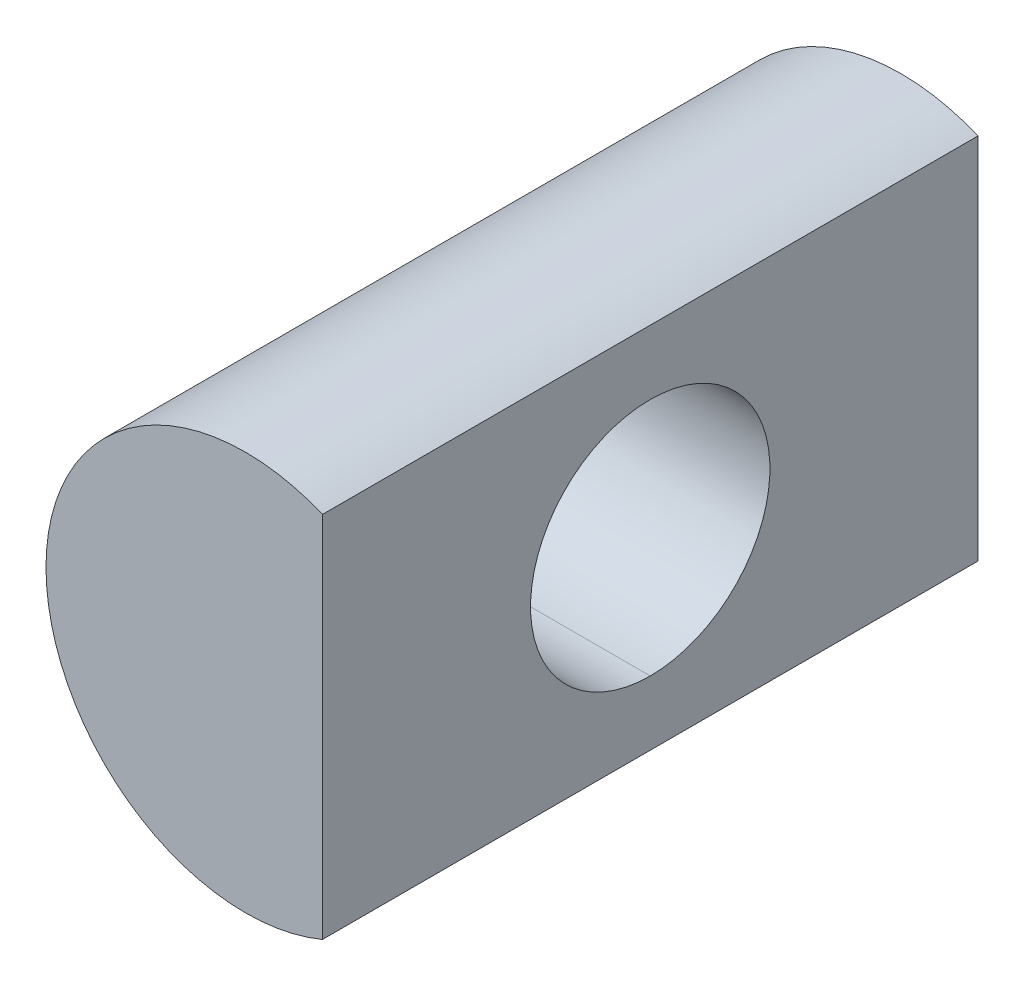
ISO-10303-21;
HEADER;
FILE_DESCRIPTION(('STEP AP214'),'2;1');
FILE_NAME('part.step','',(''),(''),'','','');
FILE_SCHEMA(('AUTOMOTIVE_DESIGN { 1 0 10303 214 1 1 1 1 }'));
ENDSEC;
DATA;
#1=APPLICATION_CONTEXT('core data for automotive mechanical design processes');
#2=APPLICATION_PROTOCOL_DEFINITION('international standard','automotive_design',2000,#1);
#3=PRODUCT_CONTEXT('',#1,'mechanical');
#4=PRODUCT('Part','Part','',(#3));
#5=PRODUCT_RELATED_PRODUCT_CATEGORY('part','',(#4));
#6=PRODUCT_DEFINITION_FORMATION('','',#4);
#7=PRODUCT_DEFINITION_CONTEXT('part definition',#1,'design');
#8=PRODUCT_DEFINITION('design','',#6,#7);
#9=PRODUCT_DEFINITION_SHAPE('','',#8);
#10=(LENGTH_UNIT() NAMED_UNIT(*) SI_UNIT(.MILLI.,.METRE.));
#11=(NAMED_UNIT(*) PLANE_ANGLE_UNIT() SI_UNIT($,.RADIAN.));
#12=(NAMED_UNIT(*) SI_UNIT($,.STERADIAN.) SOLID_ANGLE_UNIT());
#13=UNCERTAINTY_MEASURE_WITH_UNIT(LENGTH_MEASURE(1.E-05),#10,'distance_accuracy_value','');
#14=(GEOMETRIC_REPRESENTATION_CONTEXT(3) GLOBAL_UNCERTAINTY_ASSIGNED_CONTEXT((#13)) GLOBAL_UNIT_ASSIGNED_CONTEXT((#10,
#11,#12)) REPRESENTATION_CONTEXT('',''));
#15=CARTESIAN_POINT('',(0.,0.,0.));
#16=DIRECTION('',(0.,0.,1.));
#17=DIRECTION('',(1.,0.,0.));
#18=AXIS2_PLACEMENT_3D('',#15,#16,#17);
#19=CARTESIAN_POINT('',(-10.65,0.,5.75));
#20=DIRECTION('',(1.,0.,0.));
#21=DIRECTION('',(0.,1.,0.));
#22=AXIS2_PLACEMENT_3D('',#19,#20,#21);
#23=CYLINDRICAL_SURFACE('',#22,2.1);
#24=DIRECTION('',(1.,0.,0.));
#25=VECTOR('',#24,1.);
#26=CARTESIAN_POINT('',(-10.65,-2.1,5.75));
#27=LINE('',#26,#25);
#28=CARTESIAN_POINT('',(-2.8,-2.1,5.75));
#29=VERTEX_POINT('',#28);
#30=CARTESIAN_POINT('',(1.35,-2.1,5.75));
#31=VERTEX_POINT('',#30);
#32=EDGE_CURVE('E132',#29,#31,#27,.T.);
#33=ORIENTED_EDGE('',*,*,#32,.F.);
#34=CARTESIAN_POINT('',(-3.5,0.,7.85));
#35=CARTESIAN_POINT('',(-3.500002052167,-0.0351317121793026,7.85000304658702));
#36=CARTESIAN_POINT('',(-3.49947111353776,-0.0702638930647501,7.8491390494139));
#37=CARTESIAN_POINT('',(-3.4973612597399,-0.140299107033091,7.84567506535938));
#38=CARTESIAN_POINT('',(-3.49578567415735,-0.175202513487797,7.84308059383386));
#39=CARTESIAN_POINT('',(-3.49160584009862,-0.244749657175746,7.83615632545237));
#40=CARTESIAN_POINT('',(-3.48900232635013,-0.279393561909107,7.83182776802899));
#41=CARTESIAN_POINT('',(-3.48278973082561,-0.348392639257208,7.82144059886601));
#42=CARTESIAN_POINT('',(-3.47917888558253,-0.382747195676508,7.81537895265825));
#43=CARTESIAN_POINT('',(-3.47097447040265,-0.4511402968776,7.80152970048918));
#44=CARTESIAN_POINT('',(-3.4663768205037,-0.485176898092861,7.79373492390803));
#45=CARTESIAN_POINT('',(-3.45622234197063,-0.552908304332892,7.77642329326585));
#46=CARTESIAN_POINT('',(-3.45065936798993,-0.586599357615255,7.76689538592889));
#47=CARTESIAN_POINT('',(-3.43859792017572,-0.653615990349325,7.74612233117976));
#48=CARTESIAN_POINT('',(-3.4320915377495,-0.686935621514492,7.73486261195019));
#49=CARTESIAN_POINT('',(-3.41816772926355,-0.753185248270826,7.71062534913538));
#50=CARTESIAN_POINT('',(-3.41074097591822,-0.786106789485666,7.69763009369784));
#51=CARTESIAN_POINT('',(-3.39533147265745,-0.85016299178365,7.67052465588064));
#52=CARTESIAN_POINT('',(-3.38737143035225,-0.88132173968213,7.65645837499445));
#53=CARTESIAN_POINT('',(-3.37079991790974,-0.942717742426417,7.62695525720146));
#54=CARTESIAN_POINT('',(-3.36218990189058,-0.972956853668599,7.61152146697537));
#55=CARTESIAN_POINT('',(-3.34438258608257,-1.03250704866834,7.57928234172479));
#56=CARTESIAN_POINT('',(-3.33518542275698,-1.06181834571423,7.56247732514648));
#57=CARTESIAN_POINT('',(-3.31626544637445,-1.11951183066613,7.52749949360584));
#58=CARTESIAN_POINT('',(-3.30654175751232,-1.14789233609019,7.50932437867231));
#59=CARTESIAN_POINT('',(-3.28662853986866,-1.20372528627256,7.47160869815848));
#60=CARTESIAN_POINT('',(-3.27643743995719,-1.23117396448057,7.45206338970328));
#61=CARTESIAN_POINT('',(-3.25564717621925,-1.28514688024068,7.41160971729304));
#62=CARTESIAN_POINT('',(-3.24504606280574,-1.31166514689346,7.39069439530584));
#63=CARTESIAN_POINT('',(-3.22349123207118,-1.36378347111722,7.34750312570474));
#64=CARTESIAN_POINT('',(-3.21253548960534,-1.38937530592529,7.32521827414485));
#65=CARTESIAN_POINT('',(-3.19032560485647,-1.43964747103514,7.27928871027442));
#66=CARTESIAN_POINT('',(-3.17906965044715,-1.46431733239038,7.25563343059833));
#67=CARTESIAN_POINT('',(-3.15626918810149,-1.51284271169367,7.20688552458576));
#68=CARTESIAN_POINT('',(-3.14472285378478,-1.53668162302458,7.18177722323192));
#69=CARTESIAN_POINT('',(-3.12176902885679,-1.58278621765658,7.13079165261173));
#70=CARTESIAN_POINT('',(-3.11036182621793,-1.6050690976728,7.10492981838906));
#71=CARTESIAN_POINT('',(-3.08777719754997,-1.64809439791671,7.05243824482416));
#72=CARTESIAN_POINT('',(-3.07659866232497,-1.6688522161943,7.02582161271609));
#73=CARTESIAN_POINT('',(-3.05455458040245,-1.70886298327506,6.97182321578215));
#74=CARTESIAN_POINT('',(-3.04368699808032,-1.72812920112901,6.9444521203735));
#75=CARTESIAN_POINT('',(-3.02234164071334,-1.76519251093028,6.88894714356728));
#76=CARTESIAN_POINT('',(-3.01186137909086,-1.783000468522,6.8608214779871));
#77=CARTESIAN_POINT('',(-2.99136057406921,-1.81718372066549,6.80381016609561));
#78=CARTESIAN_POINT('',(-2.98133757744271,-1.83356723464185,6.77493033245584));
#79=CARTESIAN_POINT('',(-2.96181594950992,-1.86493599772657,6.71641209219867));
#80=CARTESIAN_POINT('',(-2.95231535834484,-1.87992664273747,6.68677723280552));
#81=CARTESIAN_POINT('',(-2.93389295276582,-1.90854953100936,6.62675499326028));
#82=CARTESIAN_POINT('',(-2.92497011295527,-1.92218420527495,6.59636908638236));
#83=CARTESIAN_POINT('',(-2.9071736286138,-1.94900430651462,6.53271111552589));
#84=CARTESIAN_POINT('',(-2.89834637159313,-1.96209289032034,6.49938509938374));
#85=CARTESIAN_POINT('',(-2.88174340758186,-1.98639570714813,6.43252277511642));
#86=CARTESIAN_POINT('',(-2.87395146176754,-1.99763976490069,6.39900138113167));
#87=CARTESIAN_POINT('',(-2.85947701098513,-2.01830321118879,6.33175621740435));
#88=CARTESIAN_POINT('',(-2.85277920684375,-2.02774813794779,6.29804360206807));
#89=CARTESIAN_POINT('',(-2.84054402743863,-2.04485183768329,6.23041579700459));
#90=CARTESIAN_POINT('',(-2.83499327906156,-2.05253132801895,6.19650831711729));
#91=CARTESIAN_POINT('',(-2.82755136085443,-2.06275804535097,6.14539580266047));
#92=CARTESIAN_POINT('',(-2.82522492695959,-2.0659423185381,6.12837841314906));
#93=CARTESIAN_POINT('',(-2.8208741050747,-2.07187905512392,6.09429520411294));
#94=CARTESIAN_POINT('',(-2.8188486337563,-2.07463306919681,6.077229795284));
#95=CARTESIAN_POINT('',(-2.81510342286948,-2.07971215282856,6.04305137303939));
#96=CARTESIAN_POINT('',(-2.81338284345525,-2.08203840138632,6.02593862655211));
#97=CARTESIAN_POINT('',(-2.810250262839,-2.08626469289611,5.9916654906646));
#98=CARTESIAN_POINT('',(-2.80883768451979,-2.08816553313684,5.97450525245669));
#99=CARTESIAN_POINT('',(-2.80632342769089,-2.09154327058514,5.94013729359361));
#100=CARTESIAN_POINT('',(-2.80522144887673,-2.09302057731179,5.9229296351584));
#101=CARTESIAN_POINT('',(-2.80333007600967,-2.09555314087628,5.88846690482619));
#102=CARTESIAN_POINT('',(-2.80254066820552,-2.096608416281,5.87121183504864));
#103=CARTESIAN_POINT('',(-2.80127567131201,-2.09829830891228,5.83665435200759));
#104=CARTESIAN_POINT('',(-2.80080036003564,-2.09893255374677,5.81935191038827));
#105=CARTESIAN_POINT('',(-2.80016375531795,-2.09978165153701,5.78469966590959));
#106=CARTESIAN_POINT('',(-2.80000303072033,-2.09999574476569,5.76734983395859));
#107=CARTESIAN_POINT('',(-2.79999999999999,-2.10000000000001,5.75));
#108=B_SPLINE_CURVE_WITH_KNOTS('',3,(#34,#35,#36,#37,#38,#39,#40,#41,#42,#43,#44,#45,#46,#47,
#48,#49,#50,#51,#52,#53,#54,#55,#56,#57,#58,#59,#60,#61,#62,#63,#64,#65,#66,#67,#68,#69,#70,#71,
#72,#73,#74,#75,#76,#77,#78,#79,#80,#81,#82,#83,#84,#85,#86,#87,#88,#89,#90,#91,#92,#93,#94,#95,
#96,#97,#98,#99,#100,#101,#102,#103,#104,#105,#106,#107),.UNSPECIFIED.,.F.,.F.,(4,2,2,2,2,2,2,2,
2,2,2,2,2,2,2,2,2,2,2,2,2,2,2,2,2,2,2,2,2,2,2,2,2,2,2,2,4),(0.,0.10538103139596,
0.210427787905467,0.315399596141157,0.420556337222789,0.526156526941332,0.632455445791932,
0.739703384881781,0.848144064253867,0.953402934769558,1.0584329275958,1.1634385978707,
1.26862464335873,1.37419471330708,1.48035024752953,1.58728937806198,1.69520592168007,
1.80465975683527,1.91260001147047,2.01923193228832,2.12476840427742,2.22942900168234,
2.33343885023708,2.43702732244133,2.54042659871317,2.65100160401169,2.75956042468543,
2.8664397280279,2.97199226068552,3.02439083558114,3.07659597587475,3.12865499912297,
3.1806156221232,3.23252583307584,3.28443376003606,3.33638753743556,3.38843517251604),.UNSPECIFIED.);
#109=CARTESIAN_POINT('',(-3.5,0.,7.85));
#110=VERTEX_POINT('',#109);
#111=EDGE_CURVE('E102',#110,#29,#108,.T.);
#112=ORIENTED_EDGE('',*,*,#111,.F.);
#113=CARTESIAN_POINT('',(-2.8,2.1,5.75));
#114=CARTESIAN_POINT('',(-2.80000347787408,2.09999468514485,5.77312720072624));
#115=CARTESIAN_POINT('',(-2.80028806817322,2.09961588392245,5.79625444735475));
#116=CARTESIAN_POINT('',(-2.80141735773345,2.09810925219017,5.84242498329374));
#117=CARTESIAN_POINT('',(-2.80226094800111,2.09698290472146,5.86546834818701));
#118=CARTESIAN_POINT('',(-2.80450576933456,2.09397963120228,5.91147115657342));
#119=CARTESIAN_POINT('',(-2.80590681347466,2.09210295675077,5.9344306255968));
#120=CARTESIAN_POINT('',(-2.80926079538349,2.08759711916083,5.98026568974332));
#121=CARTESIAN_POINT('',(-2.81121445587081,2.08496697056152,6.00314113502774));
#122=CARTESIAN_POINT('',(-2.81566652485388,2.07895070738892,6.04880835578349));
#123=CARTESIAN_POINT('',(-2.81816652474667,2.07556238367168,6.07159968478431));
#124=CARTESIAN_POINT('',(-2.82370223718351,2.06802505640501,6.11709898981588));
#125=CARTESIAN_POINT('',(-2.82674034322597,2.06387265086515,6.13980611034792));
#126=CARTESIAN_POINT('',(-2.83334147995569,2.05480113518717,6.18513742597658));
#127=CARTESIAN_POINT('',(-2.83690761737074,2.0498774766309,6.20776025717759));
#128=CARTESIAN_POINT('',(-2.84455222415039,2.03925618118651,6.25292352420933));
#129=CARTESIAN_POINT('',(-2.8486344052836,2.03355290978665,6.27546200471428));
#130=CARTESIAN_POINT('',(-2.85729673150015,2.0213638423304,6.32045715349886));
#131=CARTESIAN_POINT('',(-2.86188107054623,2.01487139672851,6.3429112102529));
#132=CARTESIAN_POINT('',(-2.87153141011682,2.00109440667082,6.38773825339285));
#133=CARTESIAN_POINT('',(-2.87660195206586,1.99380227900048,6.41010792815397));
#134=CARTESIAN_POINT('',(-2.88720693061534,1.97841463039347,6.45476661482276));
#135=CARTESIAN_POINT('',(-2.89274612069618,1.97031067127686,6.47705158565465));
#136=CARTESIAN_POINT('',(-2.90426721834802,1.95328925283168,6.52154271376151));
#137=CARTESIAN_POINT('',(-2.91025393071922,1.94436261663079,6.54374411196136));
#138=CARTESIAN_POINT('',(-2.92219249456195,1.92636976194715,6.58641956296123));
#139=CARTESIAN_POINT('',(-2.92812440230204,1.91734490940387,6.60691666227073));
#140=CARTESIAN_POINT('',(-2.94029600925853,1.89862703443222,6.64765364143494));
#141=CARTESIAN_POINT('',(-2.94653718903121,1.88893068704975,6.6678915513455));
#142=CARTESIAN_POINT('',(-2.95930721600676,1.86886146651831,6.70811157516397));
#143=CARTESIAN_POINT('',(-2.96583764977124,1.85848465776558,6.7280912202347));
#144=CARTESIAN_POINT('',(-2.97916623914022,1.83704355471357,6.76779496449067));
#145=CARTESIAN_POINT('',(-2.98596601944384,1.82597473762183,6.78751607479814));
#146=CARTESIAN_POINT('',(-2.99981161077633,1.80313895223695,6.82670333883788));
#147=CARTESIAN_POINT('',(-3.00685900394298,1.79136691884356,6.84616598038042));
#148=CARTESIAN_POINT('',(-3.02117687525089,1.76711357928223,6.88483679253362));
#149=CARTESIAN_POINT('',(-3.02844881611202,1.75462670803319,6.90404092955238));
#150=CARTESIAN_POINT('',(-3.04291967137378,1.72940613383853,6.94149213220131));
#151=CARTESIAN_POINT('',(-3.05011528339729,1.71668811997183,6.95975104560866));
#152=CARTESIAN_POINT('',(-3.06461107636017,1.6906747233249,6.9958641872642));
#153=CARTESIAN_POINT('',(-3.07191141844921,1.67737836781811,7.01371765026975));
#154=CARTESIAN_POINT('',(-3.08659638281954,1.65020058140565,7.04902020705414));
#155=CARTESIAN_POINT('',(-3.09398117519281,1.63631771568886,7.06646812541072));
#156=CARTESIAN_POINT('',(-3.10881386615225,1.60795934985926,7.10096003833625));
#157=CARTESIAN_POINT('',(-3.11626189453998,1.59348197110953,7.11800243244448));
#158=CARTESIAN_POINT('',(-3.13119900175283,1.56392714939434,7.1516836679039));
#159=CARTESIAN_POINT('',(-3.13868811998105,1.5488474063659,7.1683204733313));
#160=CARTESIAN_POINT('',(-3.15368431475569,1.51808088589904,7.20119115357847));
#161=CARTESIAN_POINT('',(-3.16119128936163,1.50239141464845,7.21742255314348));
#162=CARTESIAN_POINT('',(-3.1761223967122,1.47056254563715,7.24931719811994));
#163=CARTESIAN_POINT('',(-3.18354674963911,1.45442546787577,7.26498265551913));
#164=CARTESIAN_POINT('',(-3.19830419340713,1.42167928384055,7.29576572236452));
#165=CARTESIAN_POINT('',(-3.20563746402705,1.4050714384613,7.31088458646479));
#166=CARTESIAN_POINT('',(-3.22019415690016,1.37138097071632,7.34057500294717));
#167=CARTESIAN_POINT('',(-3.22741774173805,1.35429918499833,7.35514742478731));
#168=CARTESIAN_POINT('',(-3.24173610294583,1.31965828176989,7.38374532597931));
#169=CARTESIAN_POINT('',(-3.24883098451442,1.30209958637987,7.39777126387473));
#170=CARTESIAN_POINT('',(-3.26287249613347,1.26650271450665,7.42527653166508));
#171=CARTESIAN_POINT('',(-3.26981913298272,1.24846456009796,7.43875588665302));
#172=CARTESIAN_POINT('',(-3.28354412205924,1.21190737269431,7.46516877809363));
#173=CARTESIAN_POINT('',(-3.29032234113448,1.19338798149968,7.47810188800193));
#174=CARTESIAN_POINT('',(-3.30369502919653,1.15585336880453,7.50343011422915));
#175=CARTESIAN_POINT('',(-3.31028904739946,1.13683711961019,7.51582394615429));
#176=CARTESIAN_POINT('',(-3.32322123667201,1.09845734027116,7.5399585860731));
#177=CARTESIAN_POINT('',(-3.3295605521909,1.07909610797465,7.55170243325137));
#178=CARTESIAN_POINT('',(-3.34196917793885,1.04002896335175,7.57453790642408));
#179=CARTESIAN_POINT('',(-3.34803953997642,1.02032491016337,7.58563214029558));
#180=CARTESIAN_POINT('',(-3.35989609064034,0.98057478269229,7.60716859944682));
#181=CARTESIAN_POINT('',(-3.36568319767476,0.960530143211967,7.61761296648702));
#182=CARTESIAN_POINT('',(-3.37695885918219,0.920102222808241,7.6378506824683));
#183=CARTESIAN_POINT('',(-3.38244815850351,0.899719970635107,7.6476456706416));
#184=CARTESIAN_POINT('',(-3.39311390802781,0.858619781542015,7.66658332237356));
#185=CARTESIAN_POINT('',(-3.39829088910159,0.837902494762476,7.67572709791533));
#186=CARTESIAN_POINT('',(-3.40850850720004,0.795340482905133,7.69370680841179));
#187=CARTESIAN_POINT('',(-3.41353683101875,0.773482548084665,7.70251849211467));
#188=CARTESIAN_POINT('',(-3.42318648095531,0.729585775746336,7.71937155313922));
#189=CARTESIAN_POINT('',(-3.42781066321529,0.707549659267651,7.72741837864015));
#190=CARTESIAN_POINT('',(-3.43664574282091,0.663303459723448,7.74274039405358));
#191=CARTESIAN_POINT('',(-3.44085924949286,0.641095595936315,7.7500204832149));
#192=CARTESIAN_POINT('',(-3.44886661728962,0.596513994532227,7.763810099218));
#193=CARTESIAN_POINT('',(-3.45266279660944,0.574141995877946,7.77032389852234));
#194=CARTESIAN_POINT('',(-3.45982936222045,0.529240153023712,7.78258144819812));
#195=CARTESIAN_POINT('',(-3.463201731007,0.506711607079542,7.78832879225242));
#196=CARTESIAN_POINT('',(-3.46951467146535,0.461504944431914,7.79905416366755));
#197=CARTESIAN_POINT('',(-3.47245684865965,0.438827732012636,7.80403505536319));
#198=CARTESIAN_POINT('',(-3.47790356736712,0.393332163329504,7.81322825698023));
#199=CARTESIAN_POINT('',(-3.48040929995346,0.370514372919114,7.81744266011275));
#200=CARTESIAN_POINT('',(-3.48497745751063,0.324746240425365,7.82510367495197));
#201=CARTESIAN_POINT('',(-3.48704062652736,0.301796188495222,7.8285515756772));
#202=CARTESIAN_POINT('',(-3.49071814001536,0.255772279185299,7.83468038612468));
#203=CARTESIAN_POINT('',(-3.49233275469686,0.232698504913401,7.83736175763438));
#204=CARTESIAN_POINT('',(-3.49510785229315,0.186436036693116,7.84195839314003));
#205=CARTESIAN_POINT('',(-3.49626811122324,0.163247291756998,7.84387327929041));
#206=CARTESIAN_POINT('',(-3.49812919747488,0.116763938022132,7.84693760248508));
#207=CARTESIAN_POINT('',(-3.49882929303908,0.0934692196395991,7.84808582041003));
#208=CARTESIAN_POINT('',(-3.49976551739839,0.0467830074444407,7.84961833699708));
#209=CARTESIAN_POINT('',(-3.50000040182938,0.0233914213415336,7.85000058685112));
#210=CARTESIAN_POINT('',(-3.5,0.,7.85));
#211=B_SPLINE_CURVE_WITH_KNOTS('',3,(#113,#114,#115,#116,#117,#118,#119,#120,#121,#122,#123,
#124,#125,#126,#127,#128,#129,#130,#131,#132,#133,#134,#135,#136,#137,#138,#139,#140,#141,#142,
#143,#144,#145,#146,#147,#148,#149,#150,#151,#152,#153,#154,#155,#156,#157,#158,#159,#160,#161,
#162,#163,#164,#165,#166,#167,#168,#169,#170,#171,#172,#173,#174,#175,#176,#177,#178,#179,#180,
#181,#182,#183,#184,#185,#186,#187,#188,#189,#190,#191,#192,#193,#194,#195,#196,#197,#198,#199,
#200,#201,#202,#203,#204,#205,#206,#207,#208,#209,#210),.UNSPECIFIED.,.F.,.F.,(4,2,2,2,2,2,2,2,
2,2,2,2,2,2,2,2,2,2,2,2,2,2,2,2,2,2,2,2,2,2,2,2,2,2,2,2,2,2,2,2,2,2,2,2,2,2,2,2,4),(0.,
0.069377153955094,0.138617081822327,0.207833811665899,0.277141485903918,0.346653798734078,
0.416483444516814,0.486741590261197,0.55753738402446,0.628977509116594,0.701165791675957,
0.774202866653031,0.848185904707128,0.917677979234702,0.987542877163578,1.05785529004984,
1.12868849335829,1.20011415928435,1.27220219243477,1.34234998408023,1.41262070286006,
1.48307460208199,1.55377146644582,1.62477046663184,1.69613002147618,1.76717116290089,
1.83803727912904,1.90878538945432,1.97947279863302,2.05015695895068,2.12089533050167,
2.19179386381836,2.26232661817322,2.33255346037418,2.40253504229664,2.47233265515986,
2.54200807565042,2.61428570667222,2.68600232407048,2.75722864512469,2.82803685612828,
2.89850042838147,2.96869391538826,3.03869273363403,3.10857292987996,3.17841093839013,
3.24828333187634,3.31826657018123,3.38843675080592),.UNSPECIFIED.);
#212=CARTESIAN_POINT('',(-2.8,2.1,5.75));
#213=VERTEX_POINT('',#212);
#214=EDGE_CURVE('E97',#213,#110,#211,.T.);
#215=ORIENTED_EDGE('',*,*,#214,.F.);
#216=DIRECTION('',(1.,0.,0.));
#217=VECTOR('',#216,1.);
#218=CARTESIAN_POINT('',(-10.65,2.1,5.75));
#219=LINE('',#218,#217);
#220=CARTESIAN_POINT('',(1.35,2.1,5.75));
#221=VERTEX_POINT('',#220);
#222=EDGE_CURVE('E100',#213,#221,#219,.T.);
#223=ORIENTED_EDGE('',*,*,#222,.T.);
#224=CARTESIAN_POINT('',(1.35,0.,5.75));
#225=DIRECTION('',(1.,0.,0.));
#226=DIRECTION('',(0.,1.,0.));
#227=AXIS2_PLACEMENT_3D('',#224,#225,#226);
#228=CIRCLE('',#227,2.1);
#229=EDGE_CURVE('E11',#221,#31,#228,.T.);
#230=ORIENTED_EDGE('',*,*,#229,.T.);
#231=EDGE_LOOP('',(#33,#112,#215,#223,#230));
#232=FACE_BOUND('',#231,.T.);
#233=ADVANCED_FACE('F16',(#232),#23,.F.);
#234=CARTESIAN_POINT('',(1.35,5.23788608357023,0.));
#235=DIRECTION('',(-1.,0.,0.));
#236=DIRECTION('',(0.,1.,0.));
#237=AXIS2_PLACEMENT_3D('',#234,#235,#236);
#238=PLANE('',#237);
#239=ORIENTED_EDGE('',*,*,#229,.F.);
#240=CARTESIAN_POINT('',(1.35,0.,5.75));
#241=DIRECTION('',(1.,0.,0.));
#242=DIRECTION('',(0.,1.,0.));
#243=AXIS2_PLACEMENT_3D('',#240,#241,#242);
#244=CIRCLE('',#243,2.1);
#245=EDGE_CURVE('E125',#31,#221,#244,.T.);
#246=ORIENTED_EDGE('',*,*,#245,.F.);
#247=EDGE_LOOP('',(#239,#246));
#248=FACE_BOUND('',#247,.T.);
#249=DIRECTION('',(0.,-1.,0.));
#250=VECTOR('',#249,1.);
#251=CARTESIAN_POINT('',(1.35,5.23788608357023,11.5));
#252=LINE('',#251,#250);
#253=CARTESIAN_POINT('',(1.35,3.22916397849351,11.5));
#254=VERTEX_POINT('',#253);
#255=CARTESIAN_POINT('',(1.35,-3.2291639784935,11.5));
#256=VERTEX_POINT('',#255);
#257=EDGE_CURVE('E108',#254,#256,#252,.T.);
#258=ORIENTED_EDGE('',*,*,#257,.T.);
#259=DIRECTION('',(0.,0.,1.));
#260=VECTOR('',#259,1.);
#261=CARTESIAN_POINT('',(1.35,-3.22916397849351,11.5));
#262=LINE('',#261,#260);
#263=CARTESIAN_POINT('',(1.35,-3.22916397849351,0.));
#264=VERTEX_POINT('',#263);
#265=EDGE_CURVE('E221',#264,#256,#262,.T.);
#266=ORIENTED_EDGE('',*,*,#265,.F.);
#267=DIRECTION('',(0.,-1.,0.));
#268=VECTOR('',#267,1.);
#269=CARTESIAN_POINT('',(1.35,0.,0.));
#270=LINE('',#269,#268);
#271=CARTESIAN_POINT('',(1.35,3.22916397849351,0.));
#272=VERTEX_POINT('',#271);
#273=EDGE_CURVE('E30',#272,#264,#270,.T.);
#274=ORIENTED_EDGE('',*,*,#273,.F.);
#275=DIRECTION('',(0.,0.,-1.));
#276=VECTOR('',#275,1.);
#277=CARTESIAN_POINT('',(1.35,3.22916397849351,11.5));
#278=LINE('',#277,#276);
#279=EDGE_CURVE('E211',#254,#272,#278,.T.);
#280=ORIENTED_EDGE('',*,*,#279,.F.);
#281=EDGE_LOOP('',(#258,#266,#274,#280));
#282=FACE_BOUND('',#281,.T.);
#283=ADVANCED_FACE('F165',(#248,#282),#238,.F.);
#284=CARTESIAN_POINT('',(0.,0.,0.));
#285=DIRECTION('',(0.,0.,1.));
#286=DIRECTION('',(1.,0.,0.));
#287=AXIS2_PLACEMENT_3D('',#284,#285,#286);
#288=PLANE('',#287);
#289=CARTESIAN_POINT('',(0.,0.,0.));
#290=DIRECTION('',(0.,0.,1.));
#291=DIRECTION('',(1.,0.,0.));
#292=AXIS2_PLACEMENT_3D('',#289,#290,#291);
#293=CIRCLE('',#292,3.5);
#294=CARTESIAN_POINT('',(-3.5,0.,0.));
#295=VERTEX_POINT('',#294);
#296=EDGE_CURVE('E109',#272,#295,#293,.T.);
#297=ORIENTED_EDGE('',*,*,#296,.F.);
#298=ORIENTED_EDGE('',*,*,#273,.T.);
#299=CARTESIAN_POINT('',(0.,0.,0.));
#300=DIRECTION('',(0.,0.,1.));
#301=DIRECTION('',(1.,0.,0.));
#302=AXIS2_PLACEMENT_3D('',#299,#300,#301);
#303=CIRCLE('',#302,3.5);
#304=EDGE_CURVE('E209',#295,#264,#303,.T.);
#305=ORIENTED_EDGE('',*,*,#304,.F.);
#306=EDGE_LOOP('',(#297,#298,#305));
#307=FACE_BOUND('',#306,.T.);
#308=ADVANCED_FACE('F197',(#307),#288,.F.);
#309=CARTESIAN_POINT('',(0.,0.,11.5));
#310=DIRECTION('',(0.,0.,1.));
#311=DIRECTION('',(1.,0.,0.));
#312=AXIS2_PLACEMENT_3D('',#309,#310,#311);
#313=PLANE('',#312);
#314=ORIENTED_EDGE('',*,*,#257,.F.);
#315=CARTESIAN_POINT('',(0.,0.,11.5));
#316=DIRECTION('',(0.,0.,1.));
#317=DIRECTION('',(1.,0.,0.));
#318=AXIS2_PLACEMENT_3D('',#315,#316,#317);
#319=CIRCLE('',#318,3.5);
#320=CARTESIAN_POINT('',(-3.5,0.,11.5));
#321=VERTEX_POINT('',#320);
#322=EDGE_CURVE('E214',#254,#321,#319,.T.);
#323=ORIENTED_EDGE('',*,*,#322,.T.);
#324=CARTESIAN_POINT('',(0.,0.,11.5));
#325=DIRECTION('',(0.,0.,1.));
#326=DIRECTION('',(1.,0.,0.));
#327=AXIS2_PLACEMENT_3D('',#324,#325,#326);
#328=CIRCLE('',#327,3.5);
#329=EDGE_CURVE('E120',#321,#256,#328,.T.);
#330=ORIENTED_EDGE('',*,*,#329,.T.);
#331=EDGE_LOOP('',(#314,#323,#330));
#332=FACE_BOUND('',#331,.T.);
#333=ADVANCED_FACE('F170',(#332),#313,.T.);
#334=CARTESIAN_POINT('',(0.,0.,11.5));
#335=DIRECTION('',(0.,0.,-1.));
#336=DIRECTION('',(-1.,0.,0.));
#337=AXIS2_PLACEMENT_3D('',#334,#335,#336);
#338=CYLINDRICAL_SURFACE('',#337,3.5);
#339=DIRECTION('',(0.,0.,-1.));
#340=VECTOR('',#339,1.);
#341=CARTESIAN_POINT('',(-3.5,0.,11.5));
#342=LINE('',#341,#340);
#343=EDGE_CURVE('E139',#321,#110,#342,.T.);
#344=ORIENTED_EDGE('',*,*,#343,.F.);
#345=ORIENTED_EDGE('',*,*,#322,.F.);
#346=ORIENTED_EDGE('',*,*,#279,.T.);
#347=ORIENTED_EDGE('',*,*,#296,.T.);
#348=DIRECTION('',(0.,0.,-1.));
#349=VECTOR('',#348,1.);
#350=CARTESIAN_POINT('',(-3.5,0.,11.5));
#351=LINE('',#350,#349);
#352=CARTESIAN_POINT('',(-3.5,0.,3.65));
#353=VERTEX_POINT('',#352);
#354=EDGE_CURVE('E88',#353,#295,#351,.T.);
#355=ORIENTED_EDGE('',*,*,#354,.F.);
#356=CARTESIAN_POINT('',(-3.5,0.,3.65));
#357=CARTESIAN_POINT('',(-3.50000040468729,0.0234319108288672,3.64999940872974));
#358=CARTESIAN_POINT('',(-3.49976470499285,0.0468639864294669,3.65038303697728));
#359=CARTESIAN_POINT('',(-3.49882523475253,0.0936310781962427,3.65192106453373));
#360=CARTESIAN_POINT('',(-3.49812270898092,0.116966186859483,3.6530734141078));
#361=CARTESIAN_POINT('',(-3.4962551613068,0.163530173793131,3.65614875387134));
#362=CARTESIAN_POINT('',(-3.49509086796008,0.186759161376508,3.65807053013966));
#363=CARTESIAN_POINT('',(-3.49230612028858,0.233101921345795,3.66268369157614));
#364=CARTESIAN_POINT('',(-3.49068588323901,0.256215743286325,3.66537471017954));
#365=CARTESIAN_POINT('',(-3.48699556344208,0.302319509739684,3.67152555488885));
#366=CARTESIAN_POINT('',(-3.48492520044924,0.325309367894142,3.67498585997796));
#367=CARTESIAN_POINT('',(-3.48034111422419,0.371156831751507,3.68267441736107));
#368=CARTESIAN_POINT('',(-3.47782663383882,0.39401414162854,3.68690398149789));
#369=CARTESIAN_POINT('',(-3.47236090053498,0.439588426277514,3.69613023453904));
#370=CARTESIAN_POINT('',(-3.46940844067799,0.462304826566143,3.70112904472116));
#371=CARTESIAN_POINT('',(-3.46307343784506,0.507589503673089,3.71189297324841));
#372=CARTESIAN_POINT('',(-3.45968927108499,0.530156864181601,3.71766098873809));
#373=CARTESIAN_POINT('',(-3.45249763692033,0.575135930251069,3.72996261243931));
#374=CARTESIAN_POINT('',(-3.44868816677071,0.597546321753842,3.73649985142346));
#375=CARTESIAN_POINT('',(-3.4406527626479,0.642204288784542,3.75033901521721));
#376=CARTESIAN_POINT('',(-3.43642448862462,0.66445010569552,3.75764525283735));
#377=CARTESIAN_POINT('',(-3.42755846463594,0.708771668821589,3.77302245127062));
#378=CARTESIAN_POINT('',(-3.42291808248955,0.730845171398466,3.78109835614905));
#379=CARTESIAN_POINT('',(-3.41323456841291,0.774816465365468,3.79801162554964));
#380=CARTESIAN_POINT('',(-3.40818855615405,0.796711509760031,3.80685447890471));
#381=CARTESIAN_POINT('',(-3.3979252923092,0.839385938879142,3.82491771791678));
#382=CARTESIAN_POINT('',(-3.39271972503042,0.860177924276757,3.83411498999045));
#383=CARTESIAN_POINT('',(-3.38199123517929,0.901438211179203,3.85317506499058));
#384=CARTESIAN_POINT('',(-3.37646754837519,0.921905568561508,3.86303948144586));
#385=CARTESIAN_POINT('',(-3.36511690337367,0.962514523933364,3.88343067493855));
#386=CARTESIAN_POINT('',(-3.35928897678333,0.982654775771025,3.89395959248747));
#387=CARTESIAN_POINT('',(-3.34734405447161,1.02260665161086,3.91567996644065));
#388=CARTESIAN_POINT('',(-3.34122592841785,1.04241650041097,3.92687406533864));
#389=CARTESIAN_POINT('',(-3.32871453453598,1.08170549039095,3.94992411600093));
#390=CARTESIAN_POINT('',(-3.32232001559787,1.10118241209041,3.96178317013216));
#391=CARTESIAN_POINT('',(-3.30926960924993,1.1398037687182,3.98616276057356));
#392=CARTESIAN_POINT('',(-3.30261239105364,1.15894552964359,3.99868681855346));
#393=CARTESIAN_POINT('',(-3.28916783758556,1.19656576606172,4.0241726299643));
#394=CARTESIAN_POINT('',(-3.2823826478639,1.21504913887113,4.03712828918911));
#395=CARTESIAN_POINT('',(-3.26864793171036,1.25152710077397,4.06357816539217));
#396=CARTESIAN_POINT('',(-3.26169861152958,1.26952224801073,4.07707171972733));
#397=CARTESIAN_POINT('',(-3.24765618750494,1.30502627558315,4.10459692620246));
#398=CARTESIAN_POINT('',(-3.24056314070452,1.32253534254358,4.11862836675982));
#399=CARTESIAN_POINT('',(-3.22625321854593,1.35707025824946,4.14722892048875));
#400=CARTESIAN_POINT('',(-3.21903629246286,1.37409590108933,4.16179825686543));
#401=CARTESIAN_POINT('',(-3.20449793235908,1.40766757969736,4.19147406649469));
#402=CARTESIAN_POINT('',(-3.19717638093058,1.4242130011037,4.20658117712134));
#403=CARTESIAN_POINT('',(-3.18244772802677,1.45682782294924,4.23733251433991));
#404=CARTESIAN_POINT('',(-3.17504048305876,1.47289618890828,4.25297776900094));
#405=CARTESIAN_POINT('',(-3.16011406468604,1.50465597327773,4.284897448818));
#406=CARTESIAN_POINT('',(-3.15259447871544,1.52034287474348,4.3011761751153));
#407=CARTESIAN_POINT('',(-3.13757393417485,1.55110325772105,4.33414374060833));
#408=CARTESIAN_POINT('',(-3.13007306895242,1.56617940195857,4.35083013755681));
#409=CARTESIAN_POINT('',(-3.11511346884603,1.59572589593217,4.38461300496776));
#410=CARTESIAN_POINT('',(-3.10765468873337,1.61019851021495,4.40170747464638));
#411=CARTESIAN_POINT('',(-3.0928015048664,1.63854632342245,4.43630591457586));
#412=CARTESIAN_POINT('',(-3.08540696919161,1.65242336008398,4.45380832239857));
#413=CARTESIAN_POINT('',(-3.07070360018776,1.67958844347432,4.48922229211583));
#414=CARTESIAN_POINT('',(-3.06339459849957,1.69287787935189,4.50713271847876));
#415=CARTESIAN_POINT('',(-3.04888248362095,1.71887663583865,4.54336204667352));
#416=CARTESIAN_POINT('',(-3.04167921545497,1.73158687849575,4.56168022485436));
#417=CARTESIAN_POINT('',(-3.02725404582342,1.75668621076139,4.59909959000935));
#418=CARTESIAN_POINT('',(-3.02003449325453,1.76906428836971,4.61820907294732));
#419=CARTESIAN_POINT('',(-3.00581974798305,1.79310930072339,4.65668910529958));
#420=CARTESIAN_POINT('',(-2.99882311833249,1.80478164604272,4.67605574122511));
#421=CARTESIAN_POINT('',(-2.98507680564111,1.82742728401814,4.71504935325049));
#422=CARTESIAN_POINT('',(-2.97832557619267,1.83840549300744,4.73467292757829));
#423=CARTESIAN_POINT('',(-2.96509141166953,1.85967434879205,4.77418001053236));
#424=CARTESIAN_POINT('',(-2.95860689421999,1.86996937890287,4.79406062831837));
#425=CARTESIAN_POINT('',(-2.94592563516872,1.88988375851774,4.83408103909686));
#426=CARTESIAN_POINT('',(-2.93972735351286,1.89950691500585,4.85421844851209));
#427=CARTESIAN_POINT('',(-2.92763798832519,1.91808708491021,4.89475276984491));
#428=CARTESIAN_POINT('',(-2.92174547345441,1.92704730558239,4.91514778491509));
#429=CARTESIAN_POINT('',(-2.90986554851277,1.94494357535914,4.95767980370327));
#430=CARTESIAN_POINT('',(-2.90389900756936,1.95383641680047,4.97984084642113));
#431=CARTESIAN_POINT('',(-2.89241709581065,1.97079345706853,5.02425123752253));
#432=CARTESIAN_POINT('',(-2.88689694769455,1.9788667650156,5.04649586876838));
#433=CARTESIAN_POINT('',(-2.87632862036212,1.99419641883866,5.09107374700018));
#434=CARTESIAN_POINT('',(-2.87127571952129,2.00146113604726,5.11340299110477));
#435=CARTESIAN_POINT('',(-2.86165912673815,2.01518647805853,5.15814907741905));
#436=CARTESIAN_POINT('',(-2.8570909263227,2.02165462395785,5.18056264037094));
#437=CARTESIAN_POINT('',(-2.84845921495629,2.03379819781142,5.22547670428392));
#438=CARTESIAN_POINT('',(-2.84439154320372,2.03948021809152,5.24797462049307));
#439=CARTESIAN_POINT('',(-2.83677419286467,2.05006204010697,5.29305666947638));
#440=CARTESIAN_POINT('',(-2.83322083439713,2.05496742507593,5.31563886803819));
#441=CARTESIAN_POINT('',(-2.82664340637676,2.06400535670043,5.36088883417905));
#442=CARTESIAN_POINT('',(-2.82361625939504,2.06814240724391,5.38355525359233));
#443=CARTESIAN_POINT('',(-2.81810054532592,2.07565192835302,5.42897307776959));
#444=CARTESIAN_POINT('',(-2.81560961019689,2.07902776390651,5.45172363786205));
#445=CARTESIAN_POINT('',(-2.81117369507188,2.08502190384932,5.49730924704424));
#446=CARTESIAN_POINT('',(-2.80922714420137,2.08764238856391,5.52014385629437));
#447=CARTESIAN_POINT('',(-2.8058853654226,2.09213170872961,5.56589717878903));
#448=CARTESIAN_POINT('',(-2.8044894294928,2.09400150952137,5.58881574552615));
#449=CARTESIAN_POINT('',(-2.80225277928849,2.09699381431464,5.63473668282598));
#450=CARTESIAN_POINT('',(-2.80141226018688,2.09811605562562,5.65773907999462));
#451=CARTESIAN_POINT('',(-2.80028706321835,2.09961722403286,5.70382761646466));
#452=CARTESIAN_POINT('',(-2.8000034957915,2.09999466616912,5.72691383130725));
#453=CARTESIAN_POINT('',(-2.8,2.1,5.75));
#454=B_SPLINE_CURVE_WITH_KNOTS('',3,(#356,#357,#358,#359,#360,#361,#362,#363,#364,#365,#366,
#367,#368,#369,#370,#371,#372,#373,#374,#375,#376,#377,#378,#379,#380,#381,#382,#383,#384,#385,
#386,#387,#388,#389,#390,#391,#392,#393,#394,#395,#396,#397,#398,#399,#400,#401,#402,#403,#404,
#405,#406,#407,#408,#409,#410,#411,#412,#413,#414,#415,#416,#417,#418,#419,#420,#421,#422,#423,
#424,#425,#426,#427,#428,#429,#430,#431,#432,#433,#434,#435,#436,#437,#438,#439,#440,#441,#442,
#443,#444,#445,#446,#447,#448,#449,#450,#451,#452,#453),.UNSPECIFIED.,.F.,.F.,(4,2,2,2,2,2,2,2,
2,2,2,2,2,2,2,2,2,2,2,2,2,2,2,2,2,2,2,2,2,2,2,2,2,2,2,2,2,2,2,2,2,2,2,2,2,2,2,2,4),(0.,
0.0702916256485049,0.140396569411149,0.210391342024559,0.280352815681385,0.350357972271916,
0.420483649826562,0.490806291316621,0.561401699881142,0.632344804306155,0.703709438205175,
0.775568135861348,0.84799194712228,0.91794927063733,0.988082298871408,1.05845407610216,
1.12912700770198,1.20016270537344,1.27162184252423,1.34231869868053,1.41293100188788,
1.4835158085026,1.5541302416461,1.62483135274026,1.69567598390948,1.76713925848931,
1.83824712483716,1.90905839121661,1.97963260761811,2.05002992586535,2.12031095224321,
2.19195525827134,2.26295286987592,2.3333726377085,2.40328512011235,2.47276242142956,
2.54187800843663,2.61570078732379,2.68858360479761,2.76062318958545,2.83191970325951,
2.90257646818014,2.97269963522608,3.04239779383814,3.11178152940034,3.18096293547204,
3.25005509067102,3.3191715118911,3.38842559684365),.UNSPECIFIED.);
#455=EDGE_CURVE('E112',#353,#213,#454,.T.);
#456=ORIENTED_EDGE('',*,*,#455,.T.);
#457=ORIENTED_EDGE('',*,*,#214,.T.);
#458=EDGE_LOOP('',(#344,#345,#346,#347,#355,#456,#457));
#459=FACE_BOUND('',#458,.T.);
#460=ADVANCED_FACE('F114',(#459),#338,.T.);
#461=CARTESIAN_POINT('',(0.,0.,11.5));
#462=DIRECTION('',(0.,0.,-1.));
#463=DIRECTION('',(-1.,0.,0.));
#464=AXIS2_PLACEMENT_3D('',#461,#462,#463);
#465=CYLINDRICAL_SURFACE('',#464,3.5);
#466=ORIENTED_EDGE('',*,*,#329,.F.);
#467=ORIENTED_EDGE('',*,*,#343,.T.);
#468=ORIENTED_EDGE('',*,*,#111,.T.);
#469=CARTESIAN_POINT('',(-2.79999999999999,-2.10000000000001,5.75));
#470=CARTESIAN_POINT('',(-2.80000349866866,-2.09999465668973,5.72686635687901));
#471=CARTESIAN_POINT('',(-2.80028825972446,-2.09961562849231,5.70373266827176));
#472=CARTESIAN_POINT('',(-2.80141818923967,-2.09810814238775,5.65754933493341));
#473=CARTESIAN_POINT('',(-2.80226224708874,-2.09698116968665,5.63449961448722));
#474=CARTESIAN_POINT('',(-2.80450829933972,-2.09397624358329,5.58848418147789));
#475=CARTESIAN_POINT('',(-2.80591010616785,-2.09209854265369,5.56551844328886));
#476=CARTESIAN_POINT('',(-2.80926590302837,-2.08759024790148,5.5196709272758));
#477=CARTESIAN_POINT('',(-2.81122061609015,-2.08495866818191,5.49678929939693));
#478=CARTESIAN_POINT('',(-2.81567507211718,-2.0789391348415,5.45110979967315));
#479=CARTESIAN_POINT('',(-2.81817640769259,-2.07554897034322,5.42831237476722));
#480=CARTESIAN_POINT('',(-2.82371506368841,-2.06800754858637,5.38280096375484));
#481=CARTESIAN_POINT('',(-2.8267547796262,-2.06385288634638,5.36008783412299));
#482=CARTESIAN_POINT('',(-2.83335939678827,-2.05477643795311,5.31474458560395));
#483=CARTESIAN_POINT('',(-2.83692740743462,-2.04985009919747,5.29211583221906));
#484=CARTESIAN_POINT('',(-2.84457600775763,-2.03922301649462,5.24694080542617));
#485=CARTESIAN_POINT('',(-2.8486603124132,-2.03351663274467,5.22439648967665));
#486=CARTESIAN_POINT('',(-2.85732711757644,-2.02132090446023,5.17938975446637));
#487=CARTESIAN_POINT('',(-2.8619138155975,-2.01482490407965,5.15692994965679));
#488=CARTESIAN_POINT('',(-2.8715690866374,-2.0010403597572,5.11209149292905));
#489=CARTESIAN_POINT('',(-2.87664220476913,-1.99374422542201,5.08971615657703));
#490=CARTESIAN_POINT('',(-2.88725253340436,-1.97834810213328,5.04504623125012));
#491=CARTESIAN_POINT('',(-2.89279450107449,-1.97023966697939,5.02275568815174));
#492=CARTESIAN_POINT('',(-2.90432131615506,-1.95320884411265,4.97825348849556));
#493=CARTESIAN_POINT('',(-2.91031097163224,-1.94427727112875,4.95604659647013));
#494=CARTESIAN_POINT('',(-2.92226372186755,-1.92626182252155,4.91333089001857));
#495=CARTESIAN_POINT('',(-2.9282072991336,-1.91721843934601,4.89279951095186));
#496=CARTESIAN_POINT('',(-2.9404033543377,-1.89846092362181,4.85199450293428));
#497=CARTESIAN_POINT('',(-2.94665732673669,-1.88874343340601,4.83172286396482));
#498=CARTESIAN_POINT('',(-2.95945392156058,-1.86862930945133,4.79143589478174));
#499=CARTESIAN_POINT('',(-2.96599814405024,-1.85822870362763,4.77142305726065));
#500=CARTESIAN_POINT('',(-2.97935517170293,-1.83673732590472,4.7316534370933));
#501=CARTESIAN_POINT('',(-2.98616961404936,-1.82564199120719,4.71189967107959));
#502=CARTESIAN_POINT('',(-3.00004526448158,-1.80275041323216,4.6726476146055));
#503=CARTESIAN_POINT('',(-3.00710806547177,-1.7909490617112,4.65315286796042));
#504=CARTESIAN_POINT('',(-3.0214573104596,-1.76663432097652,4.61441830477915));
#505=CARTESIAN_POINT('',(-3.02874522516087,-1.75411532150682,4.59518255649463));
#506=CARTESIAN_POINT('',(-3.04321850188859,-1.72888004192992,4.55774614320061));
#507=CARTESIAN_POINT('',(-3.05040008231244,-1.71618178846381,4.53953185703544));
#508=CARTESIAN_POINT('',(-3.06486723284908,-1.69021009514455,4.5035061594923));
#509=CARTESIAN_POINT('',(-3.07215296432818,-1.67693567831818,4.48569551709915));
#510=CARTESIAN_POINT('',(-3.08680820812383,-1.6498040586986,4.45047674445516));
#511=CARTESIAN_POINT('',(-3.0941778898532,-1.63594542103625,4.43306979016721));
#512=CARTESIAN_POINT('',(-3.10897999079755,-1.60763783066207,4.39865796445222));
#513=CARTESIAN_POINT('',(-3.11641253881446,-1.59318700317303,4.38165469071604));
#514=CARTESIAN_POINT('',(-3.13131844320403,-1.56368765085845,4.34804985615092));
#515=CARTESIAN_POINT('',(-3.13879183813345,-1.5486368336314,4.33145032494034));
#516=CARTESIAN_POINT('',(-3.15375647827726,-1.51793057846663,4.29865235296985));
#517=CARTESIAN_POINT('',(-3.16124762137401,-1.50227245796374,4.28245637749217));
#518=CARTESIAN_POINT('',(-3.1761545754738,-1.47049282014962,4.2506148061882));
#519=CARTESIAN_POINT('',(-3.18357055806876,-1.45437310896867,4.2349674882125));
#520=CARTESIAN_POINT('',(-3.1983114672143,-1.42166267270388,4.20421945176623));
#521=CARTESIAN_POINT('',(-3.20563657279505,-1.40507320296561,4.18911748411914));
#522=CARTESIAN_POINT('',(-3.22017719998563,-1.3714205136619,4.15945960698351));
#523=CARTESIAN_POINT('',(-3.22739288345747,-1.35435812708918,4.14490283185258));
#524=CARTESIAN_POINT('',(-3.2416957689513,-1.31975705508754,4.1163349743524));
#525=CARTESIAN_POINT('',(-3.24878307569139,-1.30221878998216,4.10232343542361));
#526=CARTESIAN_POINT('',(-3.26280982859769,-1.2666638170697,4.07484571588561));
#527=CARTESIAN_POINT('',(-3.26974928155284,-1.24864713131571,4.06137951021092));
#528=CARTESIAN_POINT('',(-3.28346036027428,-1.21213392161624,4.03499167486223));
#529=CARTESIAN_POINT('',(-3.29023185358019,-1.19363704110935,4.02207046970591));
#530=CARTESIAN_POINT('',(-3.30360273082453,-1.15611730347728,3.99674373642698));
#531=CARTESIAN_POINT('',(-3.31020133442723,-1.13709266602619,3.98434043273111));
#532=CARTESIAN_POINT('',(-3.32314251229598,-1.09869565633723,3.96018750571487));
#533=CARTESIAN_POINT('',(-3.3294862322803,-1.079325585818,3.94843483881373));
#534=CARTESIAN_POINT('',(-3.34190346014147,-1.04024030836694,3.92558238425039));
#535=CARTESIAN_POINT('',(-3.34797802097609,-1.02052696351799,3.91447998516499));
#536=CARTESIAN_POINT('',(-3.35984273574725,-0.980757799089896,3.89292785212373));
#537=CARTESIAN_POINT('',(-3.36563380902127,-0.960703416338574,3.88247597382145));
#538=CARTESIAN_POINT('',(-3.3769171428009,-0.920255558520633,3.86222389099344));
#539=CARTESIAN_POINT('',(-3.3824101487536,-0.899863113361066,3.85242204569235));
#540=CARTESIAN_POINT('',(-3.3930830242839,-0.858742090664708,3.83347133444206));
#541=CARTESIAN_POINT('',(-3.39826342489216,-0.83801416362334,3.82432135608274));
#542=CARTESIAN_POINT('',(-3.40848555454468,-0.795438915793663,3.80633342853592));
#543=CARTESIAN_POINT('',(-3.41351510047219,-0.773578522544553,3.79751947552148));
#544=CARTESIAN_POINT('',(-3.4231671054832,-0.729676760296203,3.78066207580335));
#545=CARTESIAN_POINT('',(-3.42779242189298,-0.707638113946283,3.77261317841542));
#546=CARTESIAN_POINT('',(-3.43662967698492,-0.663386784686881,3.75728721877659));
#547=CARTESIAN_POINT('',(-3.44084422610471,-0.641176322371789,3.75000525500809));
#548=CARTESIAN_POINT('',(-3.44885358255645,-0.596589456430173,3.73621208913403));
#549=CARTESIAN_POINT('',(-3.45265070908921,-0.574214792801489,3.72969661257791));
#550=CARTESIAN_POINT('',(-3.45981906947524,-0.529307555336964,3.71743590743511));
#551=CARTESIAN_POINT('',(-3.46319228669298,-0.506776280527516,3.71168708349771));
#552=CARTESIAN_POINT('',(-3.46950682103583,-0.461564098384364,3.7009589510232));
#553=CARTESIAN_POINT('',(-3.47244974438579,-0.438884095865827,3.69597677683947));
#554=CARTESIAN_POINT('',(-3.4778978491695,-0.393382888250801,3.6867812085852));
#555=CARTESIAN_POINT('',(-3.48040422218434,-0.370562249330904,3.68256572037813));
#556=CARTESIAN_POINT('',(-3.48497355118514,-0.324788364227145,3.67490273333132));
#557=CARTESIAN_POINT('',(-3.48703725150609,-0.301835408349829,3.67145394495784));
#558=CARTESIAN_POINT('',(-3.49071571508276,-0.255805638808732,3.66532355674452));
#559=CARTESIAN_POINT('',(-3.49233074859879,-0.232728908279499,3.66264149502846));
#560=CARTESIAN_POINT('',(-3.49510656833948,-0.186460478560714,3.6580436761849));
#561=CARTESIAN_POINT('',(-3.4962671303752,-0.163268728330232,3.65612829724862));
#562=CARTESIAN_POINT('',(-3.49812870430517,-0.116779318498873,3.65306318521333));
#563=CARTESIAN_POINT('',(-3.49882898397335,-0.0934815492300548,3.65191467201335));
#564=CARTESIAN_POINT('',(-3.49976545539054,-0.0467891932507424,3.65038176082773));
#565=CARTESIAN_POINT('',(-3.50000040203905,-0.0233945141838496,3.64999941285313));
#566=CARTESIAN_POINT('',(-3.5,0.,3.65));
#567=B_SPLINE_CURVE_WITH_KNOTS('',3,(#469,#470,#471,#472,#473,#474,#475,#476,#477,#478,#479,
#480,#481,#482,#483,#484,#485,#486,#487,#488,#489,#490,#491,#492,#493,#494,#495,#496,#497,#498,
#499,#500,#501,#502,#503,#504,#505,#506,#507,#508,#509,#510,#511,#512,#513,#514,#515,#516,#517,
#518,#519,#520,#521,#522,#523,#524,#525,#526,#527,#528,#529,#530,#531,#532,#533,#534,#535,#536,
#537,#538,#539,#540,#541,#542,#543,#544,#545,#546,#547,#548,#549,#550,#551,#552,#553,#554,#555,
#556,#557,#558,#559,#560,#561,#562,#563,#564,#565,#566),.UNSPECIFIED.,.F.,.F.,(4,2,2,2,2,2,2,2,
2,2,2,2,2,2,2,2,2,2,2,2,2,2,2,2,2,2,2,2,2,2,2,2,2,2,2,2,2,2,2,2,2,2,2,2,2,2,2,2,4),(0.,
0.0693964779594356,0.138655564820385,0.207891379161597,0.277218154342672,0.346749675188241,
0.416598725643055,0.486876560567333,0.557692413504848,0.629153050332419,0.701362376369156,
0.77442110198952,0.848426469246823,0.918040074990132,0.988029512283771,1.05846986094363,
1.12943476919157,1.20099626524186,1.27322459204512,1.34322274498488,1.413344619838,
1.48365008978763,1.55419856033199,1.62504882547624,1.6962589314468,1.76722074321478,
1.83800810481231,1.90867784507328,1.97928707672753,2.04989305923578,2.12055305985118,
2.19149055383679,2.26206189760973,2.33232705195792,2.40234676425324,2.47218242234348,
2.5418959002685,2.6141834711828,2.68590982699127,2.75714571134203,2.82796333777431,
2.8984362056042,2.96863889699869,3.03864685761665,3.10853616375522,3.17838327942052,
3.24826480711113,3.3182572363386,3.38843669399481),.UNSPECIFIED.);
#568=EDGE_CURVE('E298',#29,#353,#567,.T.);
#569=ORIENTED_EDGE('',*,*,#568,.T.);
#570=ORIENTED_EDGE('',*,*,#354,.T.);
#571=ORIENTED_EDGE('',*,*,#304,.T.);
#572=ORIENTED_EDGE('',*,*,#265,.T.);
#573=EDGE_LOOP('',(#466,#467,#468,#569,#570,#571,#572));
#574=FACE_BOUND('',#573,.T.);
#575=ADVANCED_FACE('F18',(#574),#465,.T.);
#576=CARTESIAN_POINT('',(-10.65,0.,5.75));
#577=DIRECTION('',(1.,0.,0.));
#578=DIRECTION('',(0.,1.,0.));
#579=AXIS2_PLACEMENT_3D('',#576,#577,#578);
#580=CYLINDRICAL_SURFACE('',#579,2.1);
#581=ORIENTED_EDGE('',*,*,#568,.F.);
#582=ORIENTED_EDGE('',*,*,#32,.T.);
#583=ORIENTED_EDGE('',*,*,#245,.T.);
#584=ORIENTED_EDGE('',*,*,#222,.F.);
#585=ORIENTED_EDGE('',*,*,#455,.F.);
#586=EDGE_LOOP('',(#581,#582,#583,#584,#585));
#587=FACE_BOUND('',#586,.T.);
#588=ADVANCED_FACE('F123',(#587),#580,.F.);
#589=CLOSED_SHELL('',(#233,#283,#308,#333,#460,#575,#588));
#590=MANIFOLD_SOLID_BREP('B1',#589);
#591=ADVANCED_BREP_SHAPE_REPRESENTATION('',(#18,#590),#14);
#592=SHAPE_DEFINITION_REPRESENTATION(#9,#591);
ENDSEC;
END-ISO-10303-21;
